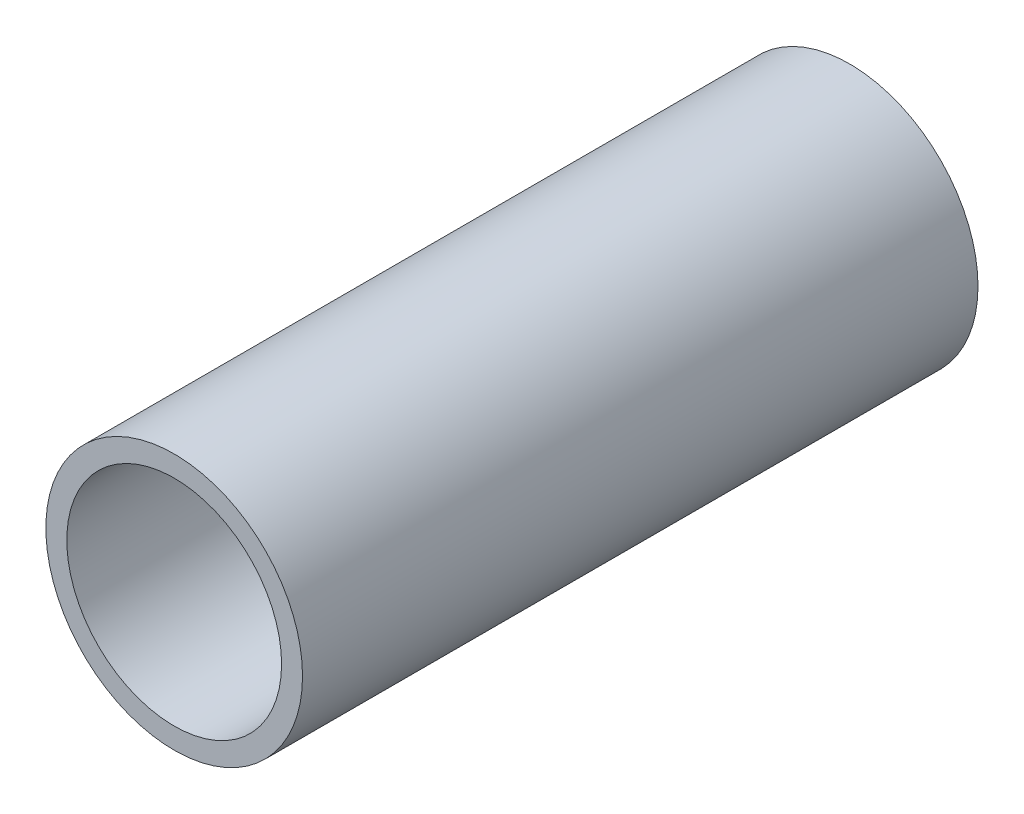
ISO-10303-21;
HEADER;
FILE_DESCRIPTION(('STEP AP214'),'2;1');
FILE_NAME('part.step','',(''),(''),'','','');
FILE_SCHEMA(('AUTOMOTIVE_DESIGN { 1 0 10303 214 1 1 1 1 }'));
ENDSEC;
DATA;
#1=APPLICATION_CONTEXT('core data for automotive mechanical design processes');
#2=APPLICATION_PROTOCOL_DEFINITION('international standard','automotive_design',2000,#1);
#3=PRODUCT_CONTEXT('',#1,'mechanical');
#4=PRODUCT('Part','Part','',(#3));
#5=PRODUCT_RELATED_PRODUCT_CATEGORY('part','',(#4));
#6=PRODUCT_DEFINITION_FORMATION('','',#4);
#7=PRODUCT_DEFINITION_CONTEXT('part definition',#1,'design');
#8=PRODUCT_DEFINITION('design','',#6,#7);
#9=PRODUCT_DEFINITION_SHAPE('','',#8);
#10=(LENGTH_UNIT() NAMED_UNIT(*) SI_UNIT(.MILLI.,.METRE.));
#11=(NAMED_UNIT(*) PLANE_ANGLE_UNIT() SI_UNIT($,.RADIAN.));
#12=(NAMED_UNIT(*) SI_UNIT($,.STERADIAN.) SOLID_ANGLE_UNIT());
#13=UNCERTAINTY_MEASURE_WITH_UNIT(LENGTH_MEASURE(1.E-05),#10,'distance_accuracy_value','');
#14=(GEOMETRIC_REPRESENTATION_CONTEXT(3) GLOBAL_UNCERTAINTY_ASSIGNED_CONTEXT((#13)) GLOBAL_UNIT_ASSIGNED_CONTEXT((#10,
#11,#12)) REPRESENTATION_CONTEXT('',''));
#15=CARTESIAN_POINT('',(0.,0.,0.));
#16=DIRECTION('',(0.,0.,1.));
#17=DIRECTION('',(1.,0.,0.));
#18=AXIS2_PLACEMENT_3D('',#15,#16,#17);
#19=CARTESIAN_POINT('',(0.,0.,127.));
#20=DIRECTION('',(0.,0.,1.));
#21=DIRECTION('',(1.,0.,0.));
#22=AXIS2_PLACEMENT_3D('',#19,#20,#21);
#23=PLANE('',#22);
#24=CARTESIAN_POINT('',(0.,0.,127.));
#25=DIRECTION('',(0.,0.,1.));
#26=DIRECTION('',(1.,0.,0.));
#27=AXIS2_PLACEMENT_3D('',#24,#25,#26);
#28=CIRCLE('',#27,24.13);
#29=CARTESIAN_POINT('',(24.13,0.,127.));
#30=VERTEX_POINT('',#29);
#31=EDGE_CURVE('E10',#30,#30,#28,.T.);
#32=ORIENTED_EDGE('',*,*,#31,.T.);
#33=EDGE_LOOP('',(#32));
#34=FACE_BOUND('',#33,.T.);
#35=CARTESIAN_POINT('',(0.,0.,127.));
#36=DIRECTION('',(0.,0.,1.));
#37=DIRECTION('',(1.,0.,0.));
#38=AXIS2_PLACEMENT_3D('',#35,#36,#37);
#39=CIRCLE('',#38,20.193);
#40=CARTESIAN_POINT('',(20.193,0.,127.));
#41=VERTEX_POINT('',#40);
#42=EDGE_CURVE('E42',#41,#41,#39,.T.);
#43=ORIENTED_EDGE('',*,*,#42,.F.);
#44=EDGE_LOOP('',(#43));
#45=FACE_BOUND('',#44,.T.);
#46=ADVANCED_FACE('F31',(#34,#45),#23,.T.);
#47=CARTESIAN_POINT('',(0.,0.,0.));
#48=DIRECTION('',(0.,0.,1.));
#49=DIRECTION('',(1.,0.,0.));
#50=AXIS2_PLACEMENT_3D('',#47,#48,#49);
#51=PLANE('',#50);
#52=CARTESIAN_POINT('',(0.,0.,0.));
#53=DIRECTION('',(0.,0.,1.));
#54=DIRECTION('',(1.,0.,0.));
#55=AXIS2_PLACEMENT_3D('',#52,#53,#54);
#56=CIRCLE('',#55,24.13);
#57=CARTESIAN_POINT('',(24.13,0.,0.));
#58=VERTEX_POINT('',#57);
#59=EDGE_CURVE('E35',#58,#58,#56,.T.);
#60=ORIENTED_EDGE('',*,*,#59,.F.);
#61=EDGE_LOOP('',(#60));
#62=FACE_BOUND('',#61,.T.);
#63=CARTESIAN_POINT('',(0.,0.,0.));
#64=DIRECTION('',(0.,0.,1.));
#65=DIRECTION('',(1.,0.,0.));
#66=AXIS2_PLACEMENT_3D('',#63,#64,#65);
#67=CIRCLE('',#66,20.193);
#68=CARTESIAN_POINT('',(20.193,0.,0.));
#69=VERTEX_POINT('',#68);
#70=EDGE_CURVE('E44',#69,#69,#67,.T.);
#71=ORIENTED_EDGE('',*,*,#70,.T.);
#72=EDGE_LOOP('',(#71));
#73=FACE_BOUND('',#72,.T.);
#74=ADVANCED_FACE('F54',(#62,#73),#51,.F.);
#75=CARTESIAN_POINT('',(0.,0.,127.));
#76=DIRECTION('',(0.,0.,-1.));
#77=DIRECTION('',(-1.,0.,0.));
#78=AXIS2_PLACEMENT_3D('',#75,#76,#77);
#79=CYLINDRICAL_SURFACE('',#78,24.13);
#80=ORIENTED_EDGE('',*,*,#31,.F.);
#81=EDGE_LOOP('',(#80));
#82=FACE_BOUND('',#81,.T.);
#83=ORIENTED_EDGE('',*,*,#59,.T.);
#84=EDGE_LOOP('',(#83));
#85=FACE_BOUND('',#84,.T.);
#86=ADVANCED_FACE('F33',(#82,#85),#79,.T.);
#87=CARTESIAN_POINT('',(0.,0.,127.));
#88=DIRECTION('',(0.,0.,-1.));
#89=DIRECTION('',(-1.,0.,0.));
#90=AXIS2_PLACEMENT_3D('',#87,#88,#89);
#91=CYLINDRICAL_SURFACE('',#90,20.193);
#92=ORIENTED_EDGE('',*,*,#42,.T.);
#93=EDGE_LOOP('',(#92));
#94=FACE_BOUND('',#93,.T.);
#95=ORIENTED_EDGE('',*,*,#70,.F.);
#96=EDGE_LOOP('',(#95));
#97=FACE_BOUND('',#96,.T.);
#98=ADVANCED_FACE('F50',(#94,#97),#91,.F.);
#99=CLOSED_SHELL('',(#46,#74,#86,#98));
#100=MANIFOLD_SOLID_BREP('B2',#99);
#101=ADVANCED_BREP_SHAPE_REPRESENTATION('',(#18,#100),#14);
#102=SHAPE_DEFINITION_REPRESENTATION(#9,#101);
ENDSEC;
END-ISO-10303-21;
